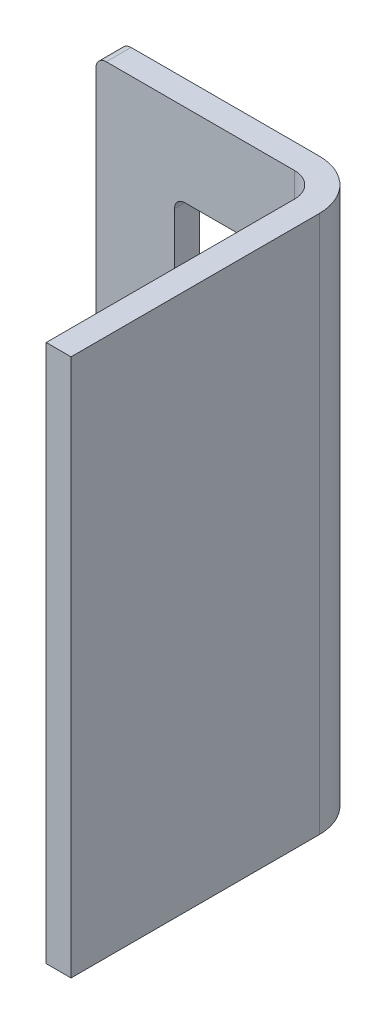
ISO-10303-21;
HEADER;
FILE_DESCRIPTION(('STEP AP214'),'2;1');
FILE_NAME('part.step','',(''),(''),'','','');
FILE_SCHEMA(('AUTOMOTIVE_DESIGN { 1 0 10303 214 1 1 1 1 }'));
ENDSEC;
DATA;
#1=APPLICATION_CONTEXT('core data for automotive mechanical design processes');
#2=APPLICATION_PROTOCOL_DEFINITION('international standard','automotive_design',2000,#1);
#3=PRODUCT_CONTEXT('',#1,'mechanical');
#4=PRODUCT('Part','Part','',(#3));
#5=PRODUCT_RELATED_PRODUCT_CATEGORY('part','',(#4));
#6=PRODUCT_DEFINITION_FORMATION('','',#4);
#7=PRODUCT_DEFINITION_CONTEXT('part definition',#1,'design');
#8=PRODUCT_DEFINITION('design','',#6,#7);
#9=PRODUCT_DEFINITION_SHAPE('','',#8);
#10=(LENGTH_UNIT() NAMED_UNIT(*) SI_UNIT(.MILLI.,.METRE.));
#11=(NAMED_UNIT(*) PLANE_ANGLE_UNIT() SI_UNIT($,.RADIAN.));
#12=(NAMED_UNIT(*) SI_UNIT($,.STERADIAN.) SOLID_ANGLE_UNIT());
#13=UNCERTAINTY_MEASURE_WITH_UNIT(LENGTH_MEASURE(1.E-05),#10,'distance_accuracy_value','');
#14=(GEOMETRIC_REPRESENTATION_CONTEXT(3) GLOBAL_UNCERTAINTY_ASSIGNED_CONTEXT((#13)) GLOBAL_UNIT_ASSIGNED_CONTEXT((#10,
#11,#12)) REPRESENTATION_CONTEXT('',''));
#15=CARTESIAN_POINT('',(0.,0.,0.));
#16=DIRECTION('',(0.,0.,1.));
#17=DIRECTION('',(1.,0.,0.));
#18=AXIS2_PLACEMENT_3D('',#15,#16,#17);
#19=CARTESIAN_POINT('',(59.2,151.5,-302.6));
#20=DIRECTION('',(1.,0.,0.));
#21=DIRECTION('',(0.,0.,-1.));
#22=AXIS2_PLACEMENT_3D('',#19,#20,#21);
#23=PLANE('',#22);
#24=DIRECTION('',(0.,-1.,0.));
#25=VECTOR('',#24,1.);
#26=CARTESIAN_POINT('',(59.2,151.5,-303.8));
#27=LINE('',#26,#25);
#28=CARTESIAN_POINT('',(59.2,151.,-303.8));
#29=VERTEX_POINT('',#28);
#30=CARTESIAN_POINT('',(59.2,126.,-303.8));
#31=VERTEX_POINT('',#30);
#32=EDGE_CURVE('E218',#29,#31,#27,.T.);
#33=ORIENTED_EDGE('',*,*,#32,.T.);
#34=DIRECTION('',(0.,0.,1.));
#35=VECTOR('',#34,1.);
#36=CARTESIAN_POINT('',(59.2,126.,-302.6));
#37=LINE('',#36,#35);
#38=CARTESIAN_POINT('',(59.2,126.,-302.6));
#39=VERTEX_POINT('',#38);
#40=EDGE_CURVE('E317',#31,#39,#37,.T.);
#41=ORIENTED_EDGE('',*,*,#40,.T.);
#42=DIRECTION('',(0.,-1.,0.));
#43=VECTOR('',#42,1.);
#44=CARTESIAN_POINT('',(59.2,151.5,-302.6));
#45=LINE('',#44,#43);
#46=CARTESIAN_POINT('',(59.2,151.,-302.6));
#47=VERTEX_POINT('',#46);
#48=EDGE_CURVE('E193',#47,#39,#45,.T.);
#49=ORIENTED_EDGE('',*,*,#48,.F.);
#50=DIRECTION('',(0.,0.,1.));
#51=VECTOR('',#50,1.);
#52=CARTESIAN_POINT('',(59.2,151.,-302.6));
#53=LINE('',#52,#51);
#54=EDGE_CURVE('E314',#47,#29,#53,.F.);
#55=ORIENTED_EDGE('',*,*,#54,.T.);
#56=EDGE_LOOP('',(#33,#41,#49,#55));
#57=FACE_BOUND('',#56,.T.);
#58=ADVANCED_FACE('F45',(#57),#23,.F.);
#59=CARTESIAN_POINT('',(68.8,151.5,-302.6));
#60=DIRECTION('',(0.,0.,-1.));
#61=DIRECTION('',(-1.,0.,0.));
#62=AXIS2_PLACEMENT_3D('',#59,#60,#61);
#63=PLANE('',#62);
#64=DIRECTION('',(-1.,0.,0.));
#65=VECTOR('',#64,1.);
#66=CARTESIAN_POINT('',(63.,147.5,-302.6));
#67=LINE('',#66,#65);
#68=CARTESIAN_POINT('',(67.5,147.5,-302.6));
#69=VERTEX_POINT('',#68);
#70=CARTESIAN_POINT('',(63.5,147.5,-302.6));
#71=VERTEX_POINT('',#70);
#72=EDGE_CURVE('E426',#69,#71,#67,.T.);
#73=ORIENTED_EDGE('',*,*,#72,.F.);
#74=CARTESIAN_POINT('',(67.5,147.,-302.6));
#75=DIRECTION('',(0.,0.,-1.));
#76=DIRECTION('',(-1.,0.,0.));
#77=AXIS2_PLACEMENT_3D('',#74,#75,#76);
#78=CIRCLE('',#77,0.5);
#79=CARTESIAN_POINT('',(68.,147.,-302.6));
#80=VERTEX_POINT('',#79);
#81=EDGE_CURVE('E290',#69,#80,#78,.T.);
#82=ORIENTED_EDGE('',*,*,#81,.T.);
#83=DIRECTION('',(0.,1.,0.));
#84=VECTOR('',#83,1.);
#85=CARTESIAN_POINT('',(68.,129.5,-302.6));
#86=LINE('',#85,#84);
#87=CARTESIAN_POINT('',(68.,130.,-302.6));
#88=VERTEX_POINT('',#87);
#89=EDGE_CURVE('E423',#88,#80,#86,.T.);
#90=ORIENTED_EDGE('',*,*,#89,.F.);
#91=CARTESIAN_POINT('',(67.5,130.,-302.6));
#92=DIRECTION('',(0.,0.,-1.));
#93=DIRECTION('',(-1.,0.,0.));
#94=AXIS2_PLACEMENT_3D('',#91,#92,#93);
#95=CIRCLE('',#94,0.5);
#96=CARTESIAN_POINT('',(67.5,129.5,-302.6));
#97=VERTEX_POINT('',#96);
#98=EDGE_CURVE('E308',#88,#97,#95,.T.);
#99=ORIENTED_EDGE('',*,*,#98,.T.);
#100=DIRECTION('',(1.,0.,0.));
#101=VECTOR('',#100,1.);
#102=CARTESIAN_POINT('',(63.,129.5,-302.6));
#103=LINE('',#102,#101);
#104=CARTESIAN_POINT('',(63.5,129.5,-302.6));
#105=VERTEX_POINT('',#104);
#106=EDGE_CURVE('E409',#105,#97,#103,.T.);
#107=ORIENTED_EDGE('',*,*,#106,.F.);
#108=CARTESIAN_POINT('',(63.5,130.,-302.6));
#109=DIRECTION('',(0.,0.,-1.));
#110=DIRECTION('',(-1.,0.,0.));
#111=AXIS2_PLACEMENT_3D('',#108,#109,#110);
#112=CIRCLE('',#111,0.5);
#113=CARTESIAN_POINT('',(63.,130.,-302.6));
#114=VERTEX_POINT('',#113);
#115=EDGE_CURVE('E302',#105,#114,#112,.T.);
#116=ORIENTED_EDGE('',*,*,#115,.T.);
#117=DIRECTION('',(0.,-1.,0.));
#118=VECTOR('',#117,1.);
#119=CARTESIAN_POINT('',(63.,129.5,-302.6));
#120=LINE('',#119,#118);
#121=CARTESIAN_POINT('',(63.,147.,-302.6));
#122=VERTEX_POINT('',#121);
#123=EDGE_CURVE('E417',#122,#114,#120,.T.);
#124=ORIENTED_EDGE('',*,*,#123,.F.);
#125=CARTESIAN_POINT('',(63.5,147.,-302.6));
#126=DIRECTION('',(0.,0.,-1.));
#127=DIRECTION('',(-1.,0.,0.));
#128=AXIS2_PLACEMENT_3D('',#125,#126,#127);
#129=CIRCLE('',#128,0.5);
#130=EDGE_CURVE('E296',#122,#71,#129,.T.);
#131=ORIENTED_EDGE('',*,*,#130,.T.);
#132=EDGE_LOOP('',(#73,#82,#90,#99,#107,#116,#124,#131));
#133=FACE_BOUND('',#132,.T.);
#134=ORIENTED_EDGE('',*,*,#48,.T.);
#135=CARTESIAN_POINT('',(59.7,126.,-302.6));
#136=DIRECTION('',(0.,0.,-1.));
#137=DIRECTION('',(-1.,0.,0.));
#138=AXIS2_PLACEMENT_3D('',#135,#136,#137);
#139=CIRCLE('',#138,0.5);
#140=CARTESIAN_POINT('',(59.7,125.5,-302.6));
#141=VERTEX_POINT('',#140);
#142=EDGE_CURVE('E324',#39,#141,#139,.F.);
#143=ORIENTED_EDGE('',*,*,#142,.T.);
#144=DIRECTION('',(1.,0.,0.));
#145=VECTOR('',#144,1.);
#146=CARTESIAN_POINT('',(68.8,125.5,-302.6));
#147=LINE('',#146,#145);
#148=CARTESIAN_POINT('',(68.8,125.5,-302.6));
#149=VERTEX_POINT('',#148);
#150=EDGE_CURVE('E189',#141,#149,#147,.T.);
#151=ORIENTED_EDGE('',*,*,#150,.T.);
#152=DIRECTION('',(0.,-1.,0.));
#153=VECTOR('',#152,1.);
#154=CARTESIAN_POINT('',(68.8,151.5,-302.6));
#155=LINE('',#154,#153);
#156=CARTESIAN_POINT('',(68.8,151.5,-302.6));
#157=VERTEX_POINT('',#156);
#158=EDGE_CURVE('E186',#157,#149,#155,.T.);
#159=ORIENTED_EDGE('',*,*,#158,.F.);
#160=DIRECTION('',(1.,0.,0.));
#161=VECTOR('',#160,1.);
#162=CARTESIAN_POINT('',(68.8,151.5,-302.6));
#163=LINE('',#162,#161);
#164=CARTESIAN_POINT('',(59.7,151.5,-302.6));
#165=VERTEX_POINT('',#164);
#166=EDGE_CURVE('E174',#165,#157,#163,.T.);
#167=ORIENTED_EDGE('',*,*,#166,.F.);
#168=CARTESIAN_POINT('',(59.7,151.,-302.6));
#169=DIRECTION('',(0.,0.,-1.));
#170=DIRECTION('',(-1.,0.,0.));
#171=AXIS2_PLACEMENT_3D('',#168,#169,#170);
#172=CIRCLE('',#171,0.5);
#173=EDGE_CURVE('E321',#165,#47,#172,.F.);
#174=ORIENTED_EDGE('',*,*,#173,.T.);
#175=EDGE_LOOP('',(#134,#143,#151,#159,#167,#174));
#176=FACE_BOUND('',#175,.T.);
#177=ADVANCED_FACE('F188',(#133,#176),#63,.F.);
#178=CARTESIAN_POINT('',(68.8,151.5,-301.4));
#179=DIRECTION('',(0.,-1.,0.));
#180=DIRECTION('',(0.,0.,-1.));
#181=AXIS2_PLACEMENT_3D('',#178,#179,#180);
#182=CYLINDRICAL_SURFACE('',#181,1.20000000000002);
#183=CARTESIAN_POINT('',(68.8,125.5,-301.4));
#184=DIRECTION('',(0.,-1.,0.));
#185=DIRECTION('',(0.,0.,1.));
#186=AXIS2_PLACEMENT_3D('',#183,#184,#185);
#187=CIRCLE('',#186,1.20000000000002);
#188=CARTESIAN_POINT('',(70.,125.5,-301.4));
#189=VERTEX_POINT('',#188);
#190=EDGE_CURVE('E221',#149,#189,#187,.T.);
#191=ORIENTED_EDGE('',*,*,#190,.T.);
#192=DIRECTION('',(0.,-1.,0.));
#193=VECTOR('',#192,1.);
#194=CARTESIAN_POINT('',(70.,151.5,-301.4));
#195=LINE('',#194,#193);
#196=CARTESIAN_POINT('',(70.,151.5,-301.4));
#197=VERTEX_POINT('',#196);
#198=EDGE_CURVE('E194',#197,#189,#195,.T.);
#199=ORIENTED_EDGE('',*,*,#198,.F.);
#200=CARTESIAN_POINT('',(68.8,151.5,-301.4));
#201=DIRECTION('',(0.,-1.,0.));
#202=DIRECTION('',(0.,0.,1.));
#203=AXIS2_PLACEMENT_3D('',#200,#201,#202);
#204=CIRCLE('',#203,1.20000000000002);
#205=EDGE_CURVE('E178',#157,#197,#204,.T.);
#206=ORIENTED_EDGE('',*,*,#205,.F.);
#207=ORIENTED_EDGE('',*,*,#158,.T.);
#208=EDGE_LOOP('',(#191,#199,#206,#207));
#209=FACE_BOUND('',#208,.T.);
#210=ADVANCED_FACE('F196',(#209),#182,.F.);
#211=CARTESIAN_POINT('',(70.,151.5,-289.4));
#212=DIRECTION('',(1.,0.,0.));
#213=DIRECTION('',(0.,0.,-1.));
#214=AXIS2_PLACEMENT_3D('',#211,#212,#213);
#215=PLANE('',#214);
#216=DIRECTION('',(0.,0.,1.));
#217=VECTOR('',#216,1.);
#218=CARTESIAN_POINT('',(70.,125.5,-289.4));
#219=LINE('',#218,#217);
#220=CARTESIAN_POINT('',(70.,125.5,-289.4));
#221=VERTEX_POINT('',#220);
#222=EDGE_CURVE('E225',#189,#221,#219,.T.);
#223=ORIENTED_EDGE('',*,*,#222,.T.);
#224=DIRECTION('',(0.,-1.,0.));
#225=VECTOR('',#224,1.);
#226=CARTESIAN_POINT('',(70.,151.5,-289.4));
#227=LINE('',#226,#225);
#228=CARTESIAN_POINT('',(70.,151.5,-289.4));
#229=VERTEX_POINT('',#228);
#230=EDGE_CURVE('E254',#229,#221,#227,.T.);
#231=ORIENTED_EDGE('',*,*,#230,.F.);
#232=DIRECTION('',(0.,0.,1.));
#233=VECTOR('',#232,1.);
#234=CARTESIAN_POINT('',(70.,151.5,-289.4));
#235=LINE('',#234,#233);
#236=EDGE_CURVE('E200',#197,#229,#235,.T.);
#237=ORIENTED_EDGE('',*,*,#236,.F.);
#238=ORIENTED_EDGE('',*,*,#198,.T.);
#239=EDGE_LOOP('',(#223,#231,#237,#238));
#240=FACE_BOUND('',#239,.T.);
#241=ADVANCED_FACE('F343',(#240),#215,.F.);
#242=CARTESIAN_POINT('',(71.2,151.5,-289.4));
#243=DIRECTION('',(0.,0.,-1.));
#244=DIRECTION('',(-1.,0.,0.));
#245=AXIS2_PLACEMENT_3D('',#242,#243,#244);
#246=PLANE('',#245);
#247=DIRECTION('',(1.,0.,0.));
#248=VECTOR('',#247,1.);
#249=CARTESIAN_POINT('',(71.2,125.5,-289.4));
#250=LINE('',#249,#248);
#251=CARTESIAN_POINT('',(71.2,125.5,-289.4));
#252=VERTEX_POINT('',#251);
#253=EDGE_CURVE('E228',#221,#252,#250,.T.);
#254=ORIENTED_EDGE('',*,*,#253,.T.);
#255=DIRECTION('',(0.,-1.,0.));
#256=VECTOR('',#255,1.);
#257=CARTESIAN_POINT('',(71.2,151.5,-289.4));
#258=LINE('',#257,#256);
#259=CARTESIAN_POINT('',(71.2,151.5,-289.4));
#260=VERTEX_POINT('',#259);
#261=EDGE_CURVE('E250',#260,#252,#258,.T.);
#262=ORIENTED_EDGE('',*,*,#261,.F.);
#263=DIRECTION('',(1.,0.,0.));
#264=VECTOR('',#263,1.);
#265=CARTESIAN_POINT('',(71.2,151.5,-289.4));
#266=LINE('',#265,#264);
#267=EDGE_CURVE('E203',#229,#260,#266,.T.);
#268=ORIENTED_EDGE('',*,*,#267,.F.);
#269=ORIENTED_EDGE('',*,*,#230,.T.);
#270=EDGE_LOOP('',(#254,#262,#268,#269));
#271=FACE_BOUND('',#270,.T.);
#272=ADVANCED_FACE('F350',(#271),#246,.F.);
#273=CARTESIAN_POINT('',(71.2,151.5,-301.4));
#274=DIRECTION('',(-1.,0.,0.));
#275=DIRECTION('',(0.,0.,1.));
#276=AXIS2_PLACEMENT_3D('',#273,#274,#275);
#277=PLANE('',#276);
#278=DIRECTION('',(0.,0.,-1.));
#279=VECTOR('',#278,1.);
#280=CARTESIAN_POINT('',(71.2,125.5,-301.4));
#281=LINE('',#280,#279);
#282=CARTESIAN_POINT('',(71.2,125.5,-301.4));
#283=VERTEX_POINT('',#282);
#284=EDGE_CURVE('E231',#252,#283,#281,.T.);
#285=ORIENTED_EDGE('',*,*,#284,.T.);
#286=DIRECTION('',(0.,-1.,0.));
#287=VECTOR('',#286,1.);
#288=CARTESIAN_POINT('',(71.2,151.5,-301.4));
#289=LINE('',#288,#287);
#290=CARTESIAN_POINT('',(71.2,151.5,-301.4));
#291=VERTEX_POINT('',#290);
#292=EDGE_CURVE('E246',#291,#283,#289,.T.);
#293=ORIENTED_EDGE('',*,*,#292,.F.);
#294=DIRECTION('',(0.,0.,-1.));
#295=VECTOR('',#294,1.);
#296=CARTESIAN_POINT('',(71.2,151.5,-301.4));
#297=LINE('',#296,#295);
#298=EDGE_CURVE('E209',#260,#291,#297,.T.);
#299=ORIENTED_EDGE('',*,*,#298,.F.);
#300=ORIENTED_EDGE('',*,*,#261,.T.);
#301=EDGE_LOOP('',(#285,#293,#299,#300));
#302=FACE_BOUND('',#301,.T.);
#303=ADVANCED_FACE('F353',(#302),#277,.F.);
#304=CARTESIAN_POINT('',(68.8,151.5,-301.4));
#305=DIRECTION('',(0.,-1.,0.));
#306=DIRECTION('',(0.,0.,-1.));
#307=AXIS2_PLACEMENT_3D('',#304,#305,#306);
#308=CYLINDRICAL_SURFACE('',#307,2.40000000000001);
#309=CARTESIAN_POINT('',(68.8,125.5,-301.4));
#310=DIRECTION('',(0.,1.,0.));
#311=DIRECTION('',(0.,0.,-1.));
#312=AXIS2_PLACEMENT_3D('',#309,#310,#311);
#313=CIRCLE('',#312,2.40000000000001);
#314=CARTESIAN_POINT('',(68.8,125.5,-303.8));
#315=VERTEX_POINT('',#314);
#316=EDGE_CURVE('E234',#283,#315,#313,.T.);
#317=ORIENTED_EDGE('',*,*,#316,.T.);
#318=DIRECTION('',(0.,-1.,0.));
#319=VECTOR('',#318,1.);
#320=CARTESIAN_POINT('',(68.8,151.5,-303.8));
#321=LINE('',#320,#319);
#322=CARTESIAN_POINT('',(68.8,151.5,-303.8));
#323=VERTEX_POINT('',#322);
#324=EDGE_CURVE('E242',#323,#315,#321,.T.);
#325=ORIENTED_EDGE('',*,*,#324,.F.);
#326=CARTESIAN_POINT('',(68.8,151.5,-301.4));
#327=DIRECTION('',(0.,1.,0.));
#328=DIRECTION('',(0.,0.,-1.));
#329=AXIS2_PLACEMENT_3D('',#326,#327,#328);
#330=CIRCLE('',#329,2.40000000000001);
#331=EDGE_CURVE('E212',#291,#323,#330,.T.);
#332=ORIENTED_EDGE('',*,*,#331,.F.);
#333=ORIENTED_EDGE('',*,*,#292,.T.);
#334=EDGE_LOOP('',(#317,#325,#332,#333));
#335=FACE_BOUND('',#334,.T.);
#336=ADVANCED_FACE('F358',(#335),#308,.T.);
#337=CARTESIAN_POINT('',(59.2,151.5,-303.8));
#338=DIRECTION('',(0.,0.,1.));
#339=DIRECTION('',(1.,0.,0.));
#340=AXIS2_PLACEMENT_3D('',#337,#338,#339);
#341=PLANE('',#340);
#342=DIRECTION('',(0.,-1.,0.));
#343=VECTOR('',#342,1.);
#344=CARTESIAN_POINT('',(63.,129.5,-303.8));
#345=LINE('',#344,#343);
#346=CARTESIAN_POINT('',(63.,147.,-303.8));
#347=VERTEX_POINT('',#346);
#348=CARTESIAN_POINT('',(63.,130.,-303.8));
#349=VERTEX_POINT('',#348);
#350=EDGE_CURVE('E414',#347,#349,#345,.T.);
#351=ORIENTED_EDGE('',*,*,#350,.T.);
#352=CARTESIAN_POINT('',(63.5,130.,-303.8));
#353=DIRECTION('',(0.,0.,1.));
#354=DIRECTION('',(1.,0.,0.));
#355=AXIS2_PLACEMENT_3D('',#352,#353,#354);
#356=CIRCLE('',#355,0.5);
#357=CARTESIAN_POINT('',(63.5,129.5,-303.8));
#358=VERTEX_POINT('',#357);
#359=EDGE_CURVE('E305',#349,#358,#356,.T.);
#360=ORIENTED_EDGE('',*,*,#359,.T.);
#361=DIRECTION('',(1.,0.,0.));
#362=VECTOR('',#361,1.);
#363=CARTESIAN_POINT('',(63.,129.5,-303.8));
#364=LINE('',#363,#362);
#365=CARTESIAN_POINT('',(67.5,129.5,-303.8));
#366=VERTEX_POINT('',#365);
#367=EDGE_CURVE('E222',#358,#366,#364,.T.);
#368=ORIENTED_EDGE('',*,*,#367,.T.);
#369=CARTESIAN_POINT('',(67.5,130.,-303.8));
#370=DIRECTION('',(0.,0.,1.));
#371=DIRECTION('',(1.,0.,0.));
#372=AXIS2_PLACEMENT_3D('',#369,#370,#371);
#373=CIRCLE('',#372,0.5);
#374=CARTESIAN_POINT('',(68.,130.,-303.8));
#375=VERTEX_POINT('',#374);
#376=EDGE_CURVE('E311',#366,#375,#373,.T.);
#377=ORIENTED_EDGE('',*,*,#376,.T.);
#378=DIRECTION('',(0.,1.,0.));
#379=VECTOR('',#378,1.);
#380=CARTESIAN_POINT('',(68.,129.5,-303.8));
#381=LINE('',#380,#379);
#382=CARTESIAN_POINT('',(68.,147.,-303.8));
#383=VERTEX_POINT('',#382);
#384=EDGE_CURVE('E399',#375,#383,#381,.T.);
#385=ORIENTED_EDGE('',*,*,#384,.T.);
#386=CARTESIAN_POINT('',(67.5,147.,-303.8));
#387=DIRECTION('',(0.,0.,1.));
#388=DIRECTION('',(1.,0.,0.));
#389=AXIS2_PLACEMENT_3D('',#386,#387,#388);
#390=CIRCLE('',#389,0.5);
#391=CARTESIAN_POINT('',(67.5,147.5,-303.8));
#392=VERTEX_POINT('',#391);
#393=EDGE_CURVE('E293',#383,#392,#390,.T.);
#394=ORIENTED_EDGE('',*,*,#393,.T.);
#395=DIRECTION('',(-1.,0.,0.));
#396=VECTOR('',#395,1.);
#397=CARTESIAN_POINT('',(63.,147.5,-303.8));
#398=LINE('',#397,#396);
#399=CARTESIAN_POINT('',(63.5,147.5,-303.8));
#400=VERTEX_POINT('',#399);
#401=EDGE_CURVE('E408',#392,#400,#398,.T.);
#402=ORIENTED_EDGE('',*,*,#401,.T.);
#403=CARTESIAN_POINT('',(63.5,147.,-303.8));
#404=DIRECTION('',(0.,0.,1.));
#405=DIRECTION('',(1.,0.,0.));
#406=AXIS2_PLACEMENT_3D('',#403,#404,#405);
#407=CIRCLE('',#406,0.5);
#408=EDGE_CURVE('E299',#400,#347,#407,.T.);
#409=ORIENTED_EDGE('',*,*,#408,.T.);
#410=EDGE_LOOP('',(#351,#360,#368,#377,#385,#394,#402,#409));
#411=FACE_BOUND('',#410,.T.);
#412=DIRECTION('',(-1.,0.,0.));
#413=VECTOR('',#412,1.);
#414=CARTESIAN_POINT('',(59.2,125.5,-303.8));
#415=LINE('',#414,#413);
#416=CARTESIAN_POINT('',(59.7,125.5,-303.8));
#417=VERTEX_POINT('',#416);
#418=EDGE_CURVE('E183',#315,#417,#415,.T.);
#419=ORIENTED_EDGE('',*,*,#418,.T.);
#420=CARTESIAN_POINT('',(59.7,126.,-303.8));
#421=DIRECTION('',(0.,0.,1.));
#422=DIRECTION('',(1.,0.,0.));
#423=AXIS2_PLACEMENT_3D('',#420,#421,#422);
#424=CIRCLE('',#423,0.5);
#425=EDGE_CURVE('E54',#417,#31,#424,.F.);
#426=ORIENTED_EDGE('',*,*,#425,.T.);
#427=ORIENTED_EDGE('',*,*,#32,.F.);
#428=CARTESIAN_POINT('',(59.7,151.,-303.8));
#429=DIRECTION('',(0.,0.,1.));
#430=DIRECTION('',(1.,0.,0.));
#431=AXIS2_PLACEMENT_3D('',#428,#429,#430);
#432=CIRCLE('',#431,0.5);
#433=CARTESIAN_POINT('',(59.7,151.5,-303.8));
#434=VERTEX_POINT('',#433);
#435=EDGE_CURVE('E61',#29,#434,#432,.F.);
#436=ORIENTED_EDGE('',*,*,#435,.T.);
#437=DIRECTION('',(-1.,0.,0.));
#438=VECTOR('',#437,1.);
#439=CARTESIAN_POINT('',(59.2,151.5,-303.8));
#440=LINE('',#439,#438);
#441=EDGE_CURVE('E215',#323,#434,#440,.T.);
#442=ORIENTED_EDGE('',*,*,#441,.F.);
#443=ORIENTED_EDGE('',*,*,#324,.T.);
#444=EDGE_LOOP('',(#419,#426,#427,#436,#442,#443));
#445=FACE_BOUND('',#444,.T.);
#446=ADVANCED_FACE('F332',(#411,#445),#341,.F.);
#447=CARTESIAN_POINT('',(68.8,151.5,-301.4));
#448=DIRECTION('',(0.,-1.,0.));
#449=DIRECTION('',(0.,0.,-1.));
#450=AXIS2_PLACEMENT_3D('',#447,#448,#449);
#451=PLANE('',#450);
#452=ORIENTED_EDGE('',*,*,#441,.T.);
#453=DIRECTION('',(0.,0.,1.));
#454=VECTOR('',#453,1.);
#455=CARTESIAN_POINT('',(59.7,151.5,-301.4));
#456=LINE('',#455,#454);
#457=EDGE_CURVE('E11',#434,#165,#456,.T.);
#458=ORIENTED_EDGE('',*,*,#457,.T.);
#459=ORIENTED_EDGE('',*,*,#166,.T.);
#460=ORIENTED_EDGE('',*,*,#205,.T.);
#461=ORIENTED_EDGE('',*,*,#236,.T.);
#462=ORIENTED_EDGE('',*,*,#267,.T.);
#463=ORIENTED_EDGE('',*,*,#298,.T.);
#464=ORIENTED_EDGE('',*,*,#331,.T.);
#465=EDGE_LOOP('',(#452,#458,#459,#460,#461,#462,#463,#464));
#466=FACE_BOUND('',#465,.T.);
#467=ADVANCED_FACE('F176',(#466),#451,.F.);
#468=CARTESIAN_POINT('',(68.8,125.5,-301.4));
#469=DIRECTION('',(0.,-1.,0.));
#470=DIRECTION('',(0.,0.,-1.));
#471=AXIS2_PLACEMENT_3D('',#468,#469,#470);
#472=PLANE('',#471);
#473=ORIENTED_EDGE('',*,*,#150,.F.);
#474=DIRECTION('',(0.,0.,1.));
#475=VECTOR('',#474,1.);
#476=CARTESIAN_POINT('',(59.7,125.5,-303.8));
#477=LINE('',#476,#475);
#478=EDGE_CURVE('E69',#141,#417,#477,.F.);
#479=ORIENTED_EDGE('',*,*,#478,.T.);
#480=ORIENTED_EDGE('',*,*,#418,.F.);
#481=ORIENTED_EDGE('',*,*,#316,.F.);
#482=ORIENTED_EDGE('',*,*,#284,.F.);
#483=ORIENTED_EDGE('',*,*,#253,.F.);
#484=ORIENTED_EDGE('',*,*,#222,.F.);
#485=ORIENTED_EDGE('',*,*,#190,.F.);
#486=EDGE_LOOP('',(#473,#479,#480,#481,#482,#483,#484,#485));
#487=FACE_BOUND('',#486,.T.);
#488=ADVANCED_FACE('F339',(#487),#472,.T.);
#489=CARTESIAN_POINT('',(68.,129.5,-303.8));
#490=DIRECTION('',(1.,0.,0.));
#491=DIRECTION('',(0.,0.,-1.));
#492=AXIS2_PLACEMENT_3D('',#489,#490,#491);
#493=PLANE('',#492);
#494=ORIENTED_EDGE('',*,*,#89,.T.);
#495=DIRECTION('',(0.,0.,1.));
#496=VECTOR('',#495,1.);
#497=CARTESIAN_POINT('',(68.,147.,-303.8));
#498=LINE('',#497,#496);
#499=EDGE_CURVE('E273',#80,#383,#498,.F.);
#500=ORIENTED_EDGE('',*,*,#499,.T.);
#501=ORIENTED_EDGE('',*,*,#384,.F.);
#502=DIRECTION('',(0.,0.,1.));
#503=VECTOR('',#502,1.);
#504=CARTESIAN_POINT('',(68.,130.,-302.6));
#505=LINE('',#504,#503);
#506=EDGE_CURVE('E269',#375,#88,#505,.T.);
#507=ORIENTED_EDGE('',*,*,#506,.T.);
#508=EDGE_LOOP('',(#494,#500,#501,#507));
#509=FACE_BOUND('',#508,.T.);
#510=ADVANCED_FACE('F404',(#509),#493,.F.);
#511=CARTESIAN_POINT('',(63.,129.5,-303.8));
#512=DIRECTION('',(0.,-1.,0.));
#513=DIRECTION('',(0.,0.,-1.));
#514=AXIS2_PLACEMENT_3D('',#511,#512,#513);
#515=PLANE('',#514);
#516=ORIENTED_EDGE('',*,*,#367,.F.);
#517=DIRECTION('',(0.,0.,1.));
#518=VECTOR('',#517,1.);
#519=CARTESIAN_POINT('',(63.5,129.5,-302.6));
#520=LINE('',#519,#518);
#521=EDGE_CURVE('E286',#358,#105,#520,.T.);
#522=ORIENTED_EDGE('',*,*,#521,.T.);
#523=ORIENTED_EDGE('',*,*,#106,.T.);
#524=DIRECTION('',(0.,0.,1.));
#525=VECTOR('',#524,1.);
#526=CARTESIAN_POINT('',(67.5,129.5,-303.8));
#527=LINE('',#526,#525);
#528=EDGE_CURVE('E283',#97,#366,#527,.F.);
#529=ORIENTED_EDGE('',*,*,#528,.T.);
#530=EDGE_LOOP('',(#516,#522,#523,#529));
#531=FACE_BOUND('',#530,.T.);
#532=ADVANCED_FACE('F441',(#531),#515,.F.);
#533=CARTESIAN_POINT('',(63.,129.5,-303.8));
#534=DIRECTION('',(-1.,0.,0.));
#535=DIRECTION('',(0.,0.,1.));
#536=AXIS2_PLACEMENT_3D('',#533,#534,#535);
#537=PLANE('',#536);
#538=ORIENTED_EDGE('',*,*,#350,.F.);
#539=DIRECTION('',(0.,0.,1.));
#540=VECTOR('',#539,1.);
#541=CARTESIAN_POINT('',(63.,147.,-302.6));
#542=LINE('',#541,#540);
#543=EDGE_CURVE('E279',#347,#122,#542,.T.);
#544=ORIENTED_EDGE('',*,*,#543,.T.);
#545=ORIENTED_EDGE('',*,*,#123,.T.);
#546=DIRECTION('',(0.,0.,1.));
#547=VECTOR('',#546,1.);
#548=CARTESIAN_POINT('',(63.,130.,-303.8));
#549=LINE('',#548,#547);
#550=EDGE_CURVE('E276',#114,#349,#549,.F.);
#551=ORIENTED_EDGE('',*,*,#550,.T.);
#552=EDGE_LOOP('',(#538,#544,#545,#551));
#553=FACE_BOUND('',#552,.T.);
#554=ADVANCED_FACE('F436',(#553),#537,.F.);
#555=CARTESIAN_POINT('',(63.,147.5,-303.8));
#556=DIRECTION('',(0.,1.,0.));
#557=DIRECTION('',(0.,0.,1.));
#558=AXIS2_PLACEMENT_3D('',#555,#556,#557);
#559=PLANE('',#558);
#560=ORIENTED_EDGE('',*,*,#401,.F.);
#561=DIRECTION('',(0.,0.,1.));
#562=VECTOR('',#561,1.);
#563=CARTESIAN_POINT('',(67.5,147.5,-302.6));
#564=LINE('',#563,#562);
#565=EDGE_CURVE('E265',#392,#69,#564,.T.);
#566=ORIENTED_EDGE('',*,*,#565,.T.);
#567=ORIENTED_EDGE('',*,*,#72,.T.);
#568=DIRECTION('',(0.,0.,1.));
#569=VECTOR('',#568,1.);
#570=CARTESIAN_POINT('',(63.5,147.5,-303.8));
#571=LINE('',#570,#569);
#572=EDGE_CURVE('E262',#71,#400,#571,.F.);
#573=ORIENTED_EDGE('',*,*,#572,.T.);
#574=EDGE_LOOP('',(#560,#566,#567,#573));
#575=FACE_BOUND('',#574,.T.);
#576=ADVANCED_FACE('F379',(#575),#559,.F.);
#577=CARTESIAN_POINT('',(67.5,147.,-303.8));
#578=DIRECTION('',(0.,0.,-1.));
#579=DIRECTION('',(-1.,0.,0.));
#580=AXIS2_PLACEMENT_3D('',#577,#578,#579);
#581=CYLINDRICAL_SURFACE('',#580,0.5);
#582=ORIENTED_EDGE('',*,*,#393,.F.);
#583=ORIENTED_EDGE('',*,*,#499,.F.);
#584=ORIENTED_EDGE('',*,*,#81,.F.);
#585=ORIENTED_EDGE('',*,*,#565,.F.);
#586=EDGE_LOOP('',(#582,#583,#584,#585));
#587=FACE_BOUND('',#586,.T.);
#588=ADVANCED_FACE('F375',(#587),#581,.F.);
#589=CARTESIAN_POINT('',(63.5,147.,-303.8));
#590=DIRECTION('',(0.,0.,-1.));
#591=DIRECTION('',(-1.,0.,0.));
#592=AXIS2_PLACEMENT_3D('',#589,#590,#591);
#593=CYLINDRICAL_SURFACE('',#592,0.5);
#594=ORIENTED_EDGE('',*,*,#408,.F.);
#595=ORIENTED_EDGE('',*,*,#572,.F.);
#596=ORIENTED_EDGE('',*,*,#130,.F.);
#597=ORIENTED_EDGE('',*,*,#543,.F.);
#598=EDGE_LOOP('',(#594,#595,#596,#597));
#599=FACE_BOUND('',#598,.T.);
#600=ADVANCED_FACE('F378',(#599),#593,.F.);
#601=CARTESIAN_POINT('',(63.5,130.,-303.8));
#602=DIRECTION('',(0.,0.,-1.));
#603=DIRECTION('',(-1.,0.,0.));
#604=AXIS2_PLACEMENT_3D('',#601,#602,#603);
#605=CYLINDRICAL_SURFACE('',#604,0.5);
#606=ORIENTED_EDGE('',*,*,#359,.F.);
#607=ORIENTED_EDGE('',*,*,#550,.F.);
#608=ORIENTED_EDGE('',*,*,#115,.F.);
#609=ORIENTED_EDGE('',*,*,#521,.F.);
#610=EDGE_LOOP('',(#606,#607,#608,#609));
#611=FACE_BOUND('',#610,.T.);
#612=ADVANCED_FACE('F383',(#611),#605,.F.);
#613=CARTESIAN_POINT('',(67.5,130.,-303.8));
#614=DIRECTION('',(0.,0.,-1.));
#615=DIRECTION('',(-1.,0.,0.));
#616=AXIS2_PLACEMENT_3D('',#613,#614,#615);
#617=CYLINDRICAL_SURFACE('',#616,0.5);
#618=ORIENTED_EDGE('',*,*,#376,.F.);
#619=ORIENTED_EDGE('',*,*,#528,.F.);
#620=ORIENTED_EDGE('',*,*,#98,.F.);
#621=ORIENTED_EDGE('',*,*,#506,.F.);
#622=EDGE_LOOP('',(#618,#619,#620,#621));
#623=FACE_BOUND('',#622,.T.);
#624=ADVANCED_FACE('F364',(#623),#617,.F.);
#625=CARTESIAN_POINT('',(59.7,126.,-302.6));
#626=DIRECTION('',(0.,0.,-1.));
#627=DIRECTION('',(-1.,0.,0.));
#628=AXIS2_PLACEMENT_3D('',#625,#626,#627);
#629=CYLINDRICAL_SURFACE('',#628,0.5);
#630=ORIENTED_EDGE('',*,*,#425,.F.);
#631=ORIENTED_EDGE('',*,*,#478,.F.);
#632=ORIENTED_EDGE('',*,*,#142,.F.);
#633=ORIENTED_EDGE('',*,*,#40,.F.);
#634=EDGE_LOOP('',(#630,#631,#632,#633));
#635=FACE_BOUND('',#634,.T.);
#636=ADVANCED_FACE('F338',(#635),#629,.T.);
#637=CARTESIAN_POINT('',(59.7,151.,-301.4));
#638=DIRECTION('',(0.,0.,1.));
#639=DIRECTION('',(1.,0.,0.));
#640=AXIS2_PLACEMENT_3D('',#637,#638,#639);
#641=CYLINDRICAL_SURFACE('',#640,0.5);
#642=ORIENTED_EDGE('',*,*,#435,.F.);
#643=ORIENTED_EDGE('',*,*,#54,.F.);
#644=ORIENTED_EDGE('',*,*,#173,.F.);
#645=ORIENTED_EDGE('',*,*,#457,.F.);
#646=EDGE_LOOP('',(#642,#643,#644,#645));
#647=FACE_BOUND('',#646,.T.);
#648=ADVANCED_FACE('F47',(#647),#641,.T.);
#649=CLOSED_SHELL('',(#58,#177,#210,#241,#272,#303,#336,#446,#467,#488,#510,#532,#554,#576,#588,
#600,#612,#624,#636,#648));
#650=MANIFOLD_SOLID_BREP('B2',#649);
#651=ADVANCED_BREP_SHAPE_REPRESENTATION('',(#18,#650),#14);
#652=SHAPE_DEFINITION_REPRESENTATION(#9,#651);
ENDSEC;
END-ISO-10303-21;
